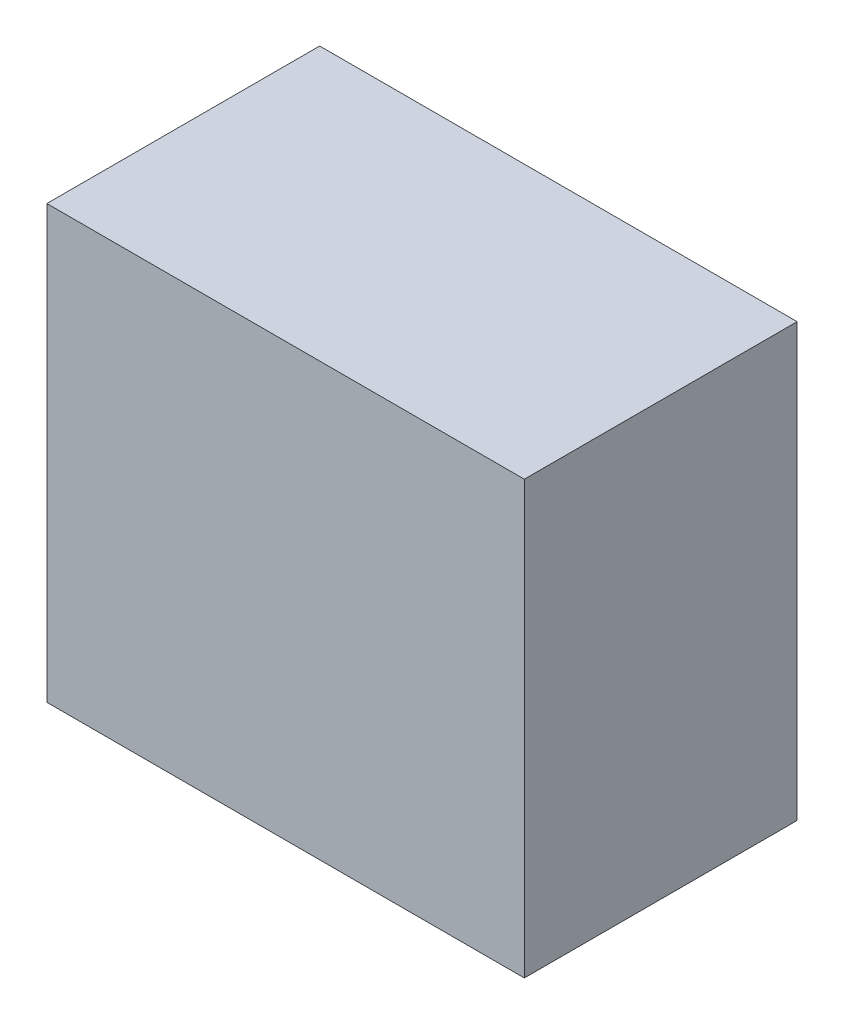
ISO-10303-21;
HEADER;
FILE_DESCRIPTION(('STEP AP214'),'2;1');
FILE_NAME('part.step','',(''),(''),'','','');
FILE_SCHEMA(('AUTOMOTIVE_DESIGN { 1 0 10303 214 1 1 1 1 }'));
ENDSEC;
DATA;
#1=APPLICATION_CONTEXT('core data for automotive mechanical design processes');
#2=APPLICATION_PROTOCOL_DEFINITION('international standard','automotive_design',2000,#1);
#3=PRODUCT_CONTEXT('',#1,'mechanical');
#4=PRODUCT('Part','Part','',(#3));
#5=PRODUCT_RELATED_PRODUCT_CATEGORY('part','',(#4));
#6=PRODUCT_DEFINITION_FORMATION('','',#4);
#7=PRODUCT_DEFINITION_CONTEXT('part definition',#1,'design');
#8=PRODUCT_DEFINITION('design','',#6,#7);
#9=PRODUCT_DEFINITION_SHAPE('','',#8);
#10=(LENGTH_UNIT() NAMED_UNIT(*) SI_UNIT(.MILLI.,.METRE.));
#11=(NAMED_UNIT(*) PLANE_ANGLE_UNIT() SI_UNIT($,.RADIAN.));
#12=(NAMED_UNIT(*) SI_UNIT($,.STERADIAN.) SOLID_ANGLE_UNIT());
#13=UNCERTAINTY_MEASURE_WITH_UNIT(LENGTH_MEASURE(1.E-05),#10,'distance_accuracy_value','');
#14=(GEOMETRIC_REPRESENTATION_CONTEXT(3) GLOBAL_UNCERTAINTY_ASSIGNED_CONTEXT((#13)) GLOBAL_UNIT_ASSIGNED_CONTEXT((#10,
#11,#12)) REPRESENTATION_CONTEXT('',''));
#15=CARTESIAN_POINT('',(0.,0.,0.));
#16=DIRECTION('',(0.,0.,1.));
#17=DIRECTION('',(1.,0.,0.));
#18=AXIS2_PLACEMENT_3D('',#15,#16,#17);
#19=CARTESIAN_POINT('',(21.,-19.,24.));
#20=DIRECTION('',(-1.,0.,0.));
#21=DIRECTION('',(0.,0.,1.));
#22=AXIS2_PLACEMENT_3D('',#19,#20,#21);
#23=PLANE('',#22);
#24=DIRECTION('',(0.,1.,0.));
#25=VECTOR('',#24,1.);
#26=CARTESIAN_POINT('',(21.,-19.,0.));
#27=LINE('',#26,#25);
#28=CARTESIAN_POINT('',(21.,-19.,0.));
#29=VERTEX_POINT('',#28);
#30=CARTESIAN_POINT('',(21.,19.,0.));
#31=VERTEX_POINT('',#30);
#32=EDGE_CURVE('E102',#29,#31,#27,.T.);
#33=ORIENTED_EDGE('',*,*,#32,.T.);
#34=DIRECTION('',(0.,0.,-1.));
#35=VECTOR('',#34,1.);
#36=CARTESIAN_POINT('',(21.,19.,24.));
#37=LINE('',#36,#35);
#38=CARTESIAN_POINT('',(21.,19.,24.));
#39=VERTEX_POINT('',#38);
#40=EDGE_CURVE('E11',#39,#31,#37,.T.);
#41=ORIENTED_EDGE('',*,*,#40,.F.);
#42=DIRECTION('',(0.,1.,0.));
#43=VECTOR('',#42,1.);
#44=CARTESIAN_POINT('',(21.,-19.,24.));
#45=LINE('',#44,#43);
#46=CARTESIAN_POINT('',(21.,-19.,24.));
#47=VERTEX_POINT('',#46);
#48=EDGE_CURVE('E95',#47,#39,#45,.T.);
#49=ORIENTED_EDGE('',*,*,#48,.F.);
#50=DIRECTION('',(0.,0.,-1.));
#51=VECTOR('',#50,1.);
#52=CARTESIAN_POINT('',(21.,-19.,24.));
#53=LINE('',#52,#51);
#54=EDGE_CURVE('E99',#47,#29,#53,.T.);
#55=ORIENTED_EDGE('',*,*,#54,.T.);
#56=EDGE_LOOP('',(#33,#41,#49,#55));
#57=FACE_BOUND('',#56,.T.);
#58=ADVANCED_FACE('F41',(#57),#23,.F.);
#59=CARTESIAN_POINT('',(-21.,19.,24.));
#60=DIRECTION('',(0.,-1.,0.));
#61=DIRECTION('',(0.,0.,-1.));
#62=AXIS2_PLACEMENT_3D('',#59,#60,#61);
#63=PLANE('',#62);
#64=DIRECTION('',(-1.,0.,0.));
#65=VECTOR('',#64,1.);
#66=CARTESIAN_POINT('',(-21.,19.,0.));
#67=LINE('',#66,#65);
#68=CARTESIAN_POINT('',(-21.,19.,0.));
#69=VERTEX_POINT('',#68);
#70=EDGE_CURVE('E96',#31,#69,#67,.T.);
#71=ORIENTED_EDGE('',*,*,#70,.T.);
#72=DIRECTION('',(0.,0.,-1.));
#73=VECTOR('',#72,1.);
#74=CARTESIAN_POINT('',(-21.,19.,24.));
#75=LINE('',#74,#73);
#76=CARTESIAN_POINT('',(-21.,19.,24.));
#77=VERTEX_POINT('',#76);
#78=EDGE_CURVE('E47',#77,#69,#75,.T.);
#79=ORIENTED_EDGE('',*,*,#78,.F.);
#80=DIRECTION('',(-1.,0.,0.));
#81=VECTOR('',#80,1.);
#82=CARTESIAN_POINT('',(-21.,19.,24.));
#83=LINE('',#82,#81);
#84=EDGE_CURVE('E87',#39,#77,#83,.T.);
#85=ORIENTED_EDGE('',*,*,#84,.F.);
#86=ORIENTED_EDGE('',*,*,#40,.T.);
#87=EDGE_LOOP('',(#71,#79,#85,#86));
#88=FACE_BOUND('',#87,.T.);
#89=ADVANCED_FACE('F92',(#88),#63,.F.);
#90=CARTESIAN_POINT('',(-21.,-19.,24.));
#91=DIRECTION('',(1.,0.,0.));
#92=DIRECTION('',(0.,0.,-1.));
#93=AXIS2_PLACEMENT_3D('',#90,#91,#92);
#94=PLANE('',#93);
#95=DIRECTION('',(0.,-1.,0.));
#96=VECTOR('',#95,1.);
#97=CARTESIAN_POINT('',(-21.,-19.,0.));
#98=LINE('',#97,#96);
#99=CARTESIAN_POINT('',(-21.,-19.,0.));
#100=VERTEX_POINT('',#99);
#101=EDGE_CURVE('E74',#69,#100,#98,.T.);
#102=ORIENTED_EDGE('',*,*,#101,.T.);
#103=DIRECTION('',(0.,0.,-1.));
#104=VECTOR('',#103,1.);
#105=CARTESIAN_POINT('',(-21.,-19.,24.));
#106=LINE('',#105,#104);
#107=CARTESIAN_POINT('',(-21.,-19.,24.));
#108=VERTEX_POINT('',#107);
#109=EDGE_CURVE('E100',#108,#100,#106,.T.);
#110=ORIENTED_EDGE('',*,*,#109,.F.);
#111=DIRECTION('',(0.,-1.,0.));
#112=VECTOR('',#111,1.);
#113=CARTESIAN_POINT('',(-21.,-19.,24.));
#114=LINE('',#113,#112);
#115=EDGE_CURVE('E89',#77,#108,#114,.T.);
#116=ORIENTED_EDGE('',*,*,#115,.F.);
#117=ORIENTED_EDGE('',*,*,#78,.T.);
#118=EDGE_LOOP('',(#102,#110,#116,#117));
#119=FACE_BOUND('',#118,.T.);
#120=ADVANCED_FACE('F98',(#119),#94,.F.);
#121=CARTESIAN_POINT('',(-21.,-19.,24.));
#122=DIRECTION('',(0.,1.,0.));
#123=DIRECTION('',(0.,0.,1.));
#124=AXIS2_PLACEMENT_3D('',#121,#122,#123);
#125=PLANE('',#124);
#126=DIRECTION('',(1.,0.,0.));
#127=VECTOR('',#126,1.);
#128=CARTESIAN_POINT('',(-21.,-19.,0.));
#129=LINE('',#128,#127);
#130=EDGE_CURVE('E76',#100,#29,#129,.T.);
#131=ORIENTED_EDGE('',*,*,#130,.T.);
#132=ORIENTED_EDGE('',*,*,#54,.F.);
#133=DIRECTION('',(1.,0.,0.));
#134=VECTOR('',#133,1.);
#135=CARTESIAN_POINT('',(-21.,-19.,24.));
#136=LINE('',#135,#134);
#137=EDGE_CURVE('E60',#108,#47,#136,.T.);
#138=ORIENTED_EDGE('',*,*,#137,.F.);
#139=ORIENTED_EDGE('',*,*,#109,.T.);
#140=EDGE_LOOP('',(#131,#132,#138,#139));
#141=FACE_BOUND('',#140,.T.);
#142=ADVANCED_FACE('F112',(#141),#125,.F.);
#143=CARTESIAN_POINT('',(0.,0.,24.));
#144=DIRECTION('',(0.,0.,-1.));
#145=DIRECTION('',(-1.,0.,0.));
#146=AXIS2_PLACEMENT_3D('',#143,#144,#145);
#147=PLANE('',#146);
#148=ORIENTED_EDGE('',*,*,#48,.T.);
#149=ORIENTED_EDGE('',*,*,#84,.T.);
#150=ORIENTED_EDGE('',*,*,#115,.T.);
#151=ORIENTED_EDGE('',*,*,#137,.T.);
#152=EDGE_LOOP('',(#148,#149,#150,#151));
#153=FACE_BOUND('',#152,.T.);
#154=ADVANCED_FACE('F86',(#153),#147,.F.);
#155=CARTESIAN_POINT('',(0.,0.,0.));
#156=DIRECTION('',(0.,0.,-1.));
#157=DIRECTION('',(-1.,0.,0.));
#158=AXIS2_PLACEMENT_3D('',#155,#156,#157);
#159=PLANE('',#158);
#160=ORIENTED_EDGE('',*,*,#32,.F.);
#161=ORIENTED_EDGE('',*,*,#130,.F.);
#162=ORIENTED_EDGE('',*,*,#101,.F.);
#163=ORIENTED_EDGE('',*,*,#70,.F.);
#164=EDGE_LOOP('',(#160,#161,#162,#163));
#165=FACE_BOUND('',#164,.T.);
#166=ADVANCED_FACE('F111',(#165),#159,.T.);
#167=CLOSED_SHELL('',(#58,#89,#120,#142,#154,#166));
#168=MANIFOLD_SOLID_BREP('B2',#167);
#169=ADVANCED_BREP_SHAPE_REPRESENTATION('',(#18,#168),#14);
#170=SHAPE_DEFINITION_REPRESENTATION(#9,#169);
ENDSEC;
END-ISO-10303-21;
